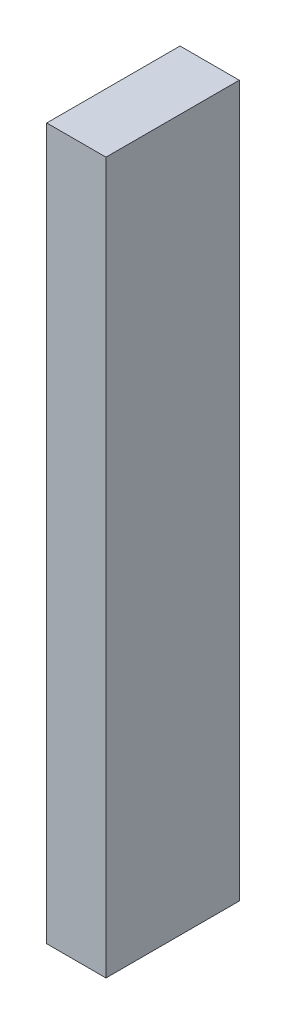
ISO-10303-21;
HEADER;
FILE_DESCRIPTION(('STEP AP214'),'2;1');
FILE_NAME('part.step','',(''),(''),'','','');
FILE_SCHEMA(('AUTOMOTIVE_DESIGN { 1 0 10303 214 1 1 1 1 }'));
ENDSEC;
DATA;
#1=APPLICATION_CONTEXT('core data for automotive mechanical design processes');
#2=APPLICATION_PROTOCOL_DEFINITION('international standard','automotive_design',2000,#1);
#3=PRODUCT_CONTEXT('',#1,'mechanical');
#4=PRODUCT('Part','Part','',(#3));
#5=PRODUCT_RELATED_PRODUCT_CATEGORY('part','',(#4));
#6=PRODUCT_DEFINITION_FORMATION('','',#4);
#7=PRODUCT_DEFINITION_CONTEXT('part definition',#1,'design');
#8=PRODUCT_DEFINITION('design','',#6,#7);
#9=PRODUCT_DEFINITION_SHAPE('','',#8);
#10=(LENGTH_UNIT() NAMED_UNIT(*) SI_UNIT(.MILLI.,.METRE.));
#11=(NAMED_UNIT(*) PLANE_ANGLE_UNIT() SI_UNIT($,.RADIAN.));
#12=(NAMED_UNIT(*) SI_UNIT($,.STERADIAN.) SOLID_ANGLE_UNIT());
#13=UNCERTAINTY_MEASURE_WITH_UNIT(LENGTH_MEASURE(1.E-05),#10,'distance_accuracy_value','');
#14=(GEOMETRIC_REPRESENTATION_CONTEXT(3) GLOBAL_UNCERTAINTY_ASSIGNED_CONTEXT((#13)) GLOBAL_UNIT_ASSIGNED_CONTEXT((#10,
#11,#12)) REPRESENTATION_CONTEXT('',''));
#15=CARTESIAN_POINT('',(0.,0.,0.));
#16=DIRECTION('',(0.,0.,1.));
#17=DIRECTION('',(1.,0.,0.));
#18=AXIS2_PLACEMENT_3D('',#15,#16,#17);
#19=CARTESIAN_POINT('',(-126.488766336441,-463.55,-181.503251150662));
#20=DIRECTION('',(1.,0.,0.));
#21=DIRECTION('',(0.,0.,1.));
#22=AXIS2_PLACEMENT_3D('',#19,#20,#21);
#23=PLANE('',#22);
#24=DIRECTION('',(0.,-1.,0.));
#25=VECTOR('',#24,1.);
#26=CARTESIAN_POINT('',(-126.488766336441,-463.55,-28.575));
#27=LINE('',#26,#25);
#28=CARTESIAN_POINT('',(-126.488766336441,-311.15,-28.575));
#29=VERTEX_POINT('',#28);
#30=CARTESIAN_POINT('',(-126.488766336441,-463.55,-28.575));
#31=VERTEX_POINT('',#30);
#32=EDGE_CURVE('E104',#29,#31,#27,.T.);
#33=ORIENTED_EDGE('',*,*,#32,.T.);
#34=DIRECTION('',(0.,0.,1.));
#35=VECTOR('',#34,1.);
#36=CARTESIAN_POINT('',(-126.488766336441,-463.55,-181.503251150662));
#37=LINE('',#36,#35);
#38=CARTESIAN_POINT('',(-126.488766336441,-463.55,0.));
#39=VERTEX_POINT('',#38);
#40=EDGE_CURVE('E97',#31,#39,#37,.T.);
#41=ORIENTED_EDGE('',*,*,#40,.T.);
#42=DIRECTION('',(0.,-1.,0.));
#43=VECTOR('',#42,1.);
#44=CARTESIAN_POINT('',(-126.488766336441,-463.55,0.));
#45=LINE('',#44,#43);
#46=CARTESIAN_POINT('',(-126.488766336441,-311.15,0.));
#47=VERTEX_POINT('',#46);
#48=EDGE_CURVE('E88',#47,#39,#45,.T.);
#49=ORIENTED_EDGE('',*,*,#48,.F.);
#50=DIRECTION('',(0.,0.,1.));
#51=VECTOR('',#50,1.);
#52=CARTESIAN_POINT('',(-126.488766336441,-311.15,-181.503251150662));
#53=LINE('',#52,#51);
#54=EDGE_CURVE('E41',#29,#47,#53,.T.);
#55=ORIENTED_EDGE('',*,*,#54,.F.);
#56=EDGE_LOOP('',(#33,#41,#49,#55));
#57=FACE_BOUND('',#56,.T.);
#58=ADVANCED_FACE('F37',(#57),#23,.F.);
#59=CARTESIAN_POINT('',(-126.488766336441,-463.55,-181.503251150662));
#60=DIRECTION('',(0.,1.,0.));
#61=DIRECTION('',(0.,0.,-1.));
#62=AXIS2_PLACEMENT_3D('',#59,#60,#61);
#63=PLANE('',#62);
#64=DIRECTION('',(1.,0.,0.));
#65=VECTOR('',#64,1.);
#66=CARTESIAN_POINT('',(-126.488766336441,-463.55,-28.575));
#67=LINE('',#66,#65);
#68=CARTESIAN_POINT('',(-113.788766336441,-463.55,-28.575));
#69=VERTEX_POINT('',#68);
#70=EDGE_CURVE('E46',#31,#69,#67,.T.);
#71=ORIENTED_EDGE('',*,*,#70,.T.);
#72=DIRECTION('',(0.,0.,1.));
#73=VECTOR('',#72,1.);
#74=CARTESIAN_POINT('',(-113.788766336441,-463.55,-181.503251150662));
#75=LINE('',#74,#73);
#76=CARTESIAN_POINT('',(-113.788766336441,-463.55,0.));
#77=VERTEX_POINT('',#76);
#78=EDGE_CURVE('E107',#69,#77,#75,.T.);
#79=ORIENTED_EDGE('',*,*,#78,.T.);
#80=DIRECTION('',(1.,0.,0.));
#81=VECTOR('',#80,1.);
#82=CARTESIAN_POINT('',(-126.488766336441,-463.55,0.));
#83=LINE('',#82,#81);
#84=EDGE_CURVE('E77',#39,#77,#83,.T.);
#85=ORIENTED_EDGE('',*,*,#84,.F.);
#86=ORIENTED_EDGE('',*,*,#40,.F.);
#87=EDGE_LOOP('',(#71,#79,#85,#86));
#88=FACE_BOUND('',#87,.T.);
#89=ADVANCED_FACE('F117',(#88),#63,.F.);
#90=CARTESIAN_POINT('',(-113.788766336441,-463.55,-181.503251150662));
#91=DIRECTION('',(-1.,0.,0.));
#92=DIRECTION('',(0.,0.,-1.));
#93=AXIS2_PLACEMENT_3D('',#90,#91,#92);
#94=PLANE('',#93);
#95=DIRECTION('',(0.,1.,0.));
#96=VECTOR('',#95,1.);
#97=CARTESIAN_POINT('',(-113.788766336441,-463.55,-28.575));
#98=LINE('',#97,#96);
#99=CARTESIAN_POINT('',(-113.788766336441,-311.15,-28.575));
#100=VERTEX_POINT('',#99);
#101=EDGE_CURVE('E11',#69,#100,#98,.T.);
#102=ORIENTED_EDGE('',*,*,#101,.T.);
#103=DIRECTION('',(0.,0.,1.));
#104=VECTOR('',#103,1.);
#105=CARTESIAN_POINT('',(-113.788766336441,-311.15,-181.503251150662));
#106=LINE('',#105,#104);
#107=CARTESIAN_POINT('',(-113.788766336441,-311.15,0.));
#108=VERTEX_POINT('',#107);
#109=EDGE_CURVE('E92',#100,#108,#106,.T.);
#110=ORIENTED_EDGE('',*,*,#109,.T.);
#111=DIRECTION('',(0.,1.,0.));
#112=VECTOR('',#111,1.);
#113=CARTESIAN_POINT('',(-113.788766336441,-463.55,0.));
#114=LINE('',#113,#112);
#115=EDGE_CURVE('E90',#77,#108,#114,.T.);
#116=ORIENTED_EDGE('',*,*,#115,.F.);
#117=ORIENTED_EDGE('',*,*,#78,.F.);
#118=EDGE_LOOP('',(#102,#110,#116,#117));
#119=FACE_BOUND('',#118,.T.);
#120=ADVANCED_FACE('F109',(#119),#94,.F.);
#121=CARTESIAN_POINT('',(-126.488766336441,-311.15,-181.503251150662));
#122=DIRECTION('',(0.,-1.,0.));
#123=DIRECTION('',(0.,0.,1.));
#124=AXIS2_PLACEMENT_3D('',#121,#122,#123);
#125=PLANE('',#124);
#126=DIRECTION('',(-1.,0.,0.));
#127=VECTOR('',#126,1.);
#128=CARTESIAN_POINT('',(-126.488766336441,-311.15,-28.575));
#129=LINE('',#128,#127);
#130=EDGE_CURVE('E54',#100,#29,#129,.T.);
#131=ORIENTED_EDGE('',*,*,#130,.T.);
#132=ORIENTED_EDGE('',*,*,#54,.T.);
#133=DIRECTION('',(-1.,0.,0.));
#134=VECTOR('',#133,1.);
#135=CARTESIAN_POINT('',(-126.488766336441,-311.15,0.));
#136=LINE('',#135,#134);
#137=EDGE_CURVE('E60',#108,#47,#136,.T.);
#138=ORIENTED_EDGE('',*,*,#137,.F.);
#139=ORIENTED_EDGE('',*,*,#109,.F.);
#140=EDGE_LOOP('',(#131,#132,#138,#139));
#141=FACE_BOUND('',#140,.T.);
#142=ADVANCED_FACE('F94',(#141),#125,.F.);
#143=CARTESIAN_POINT('',(0.,0.,0.));
#144=DIRECTION('',(0.,0.,1.));
#145=DIRECTION('',(-1.,0.,0.));
#146=AXIS2_PLACEMENT_3D('',#143,#144,#145);
#147=PLANE('',#146);
#148=ORIENTED_EDGE('',*,*,#48,.T.);
#149=ORIENTED_EDGE('',*,*,#84,.T.);
#150=ORIENTED_EDGE('',*,*,#115,.T.);
#151=ORIENTED_EDGE('',*,*,#137,.T.);
#152=EDGE_LOOP('',(#148,#149,#150,#151));
#153=FACE_BOUND('',#152,.T.);
#154=ADVANCED_FACE('F86',(#153),#147,.T.);
#155=CARTESIAN_POINT('',(0.,0.,-28.575));
#156=DIRECTION('',(0.,0.,-1.));
#157=DIRECTION('',(1.,0.,0.));
#158=AXIS2_PLACEMENT_3D('',#155,#156,#157);
#159=PLANE('',#158);
#160=ORIENTED_EDGE('',*,*,#130,.F.);
#161=ORIENTED_EDGE('',*,*,#101,.F.);
#162=ORIENTED_EDGE('',*,*,#70,.F.);
#163=ORIENTED_EDGE('',*,*,#32,.F.);
#164=EDGE_LOOP('',(#160,#161,#162,#163));
#165=FACE_BOUND('',#164,.T.);
#166=ADVANCED_FACE('F39',(#165),#159,.T.);
#167=CLOSED_SHELL('',(#58,#89,#120,#142,#154,#166));
#168=MANIFOLD_SOLID_BREP('B2',#167);
#169=ADVANCED_BREP_SHAPE_REPRESENTATION('',(#18,#168),#14);
#170=SHAPE_DEFINITION_REPRESENTATION(#9,#169);
ENDSEC;
END-ISO-10303-21;
